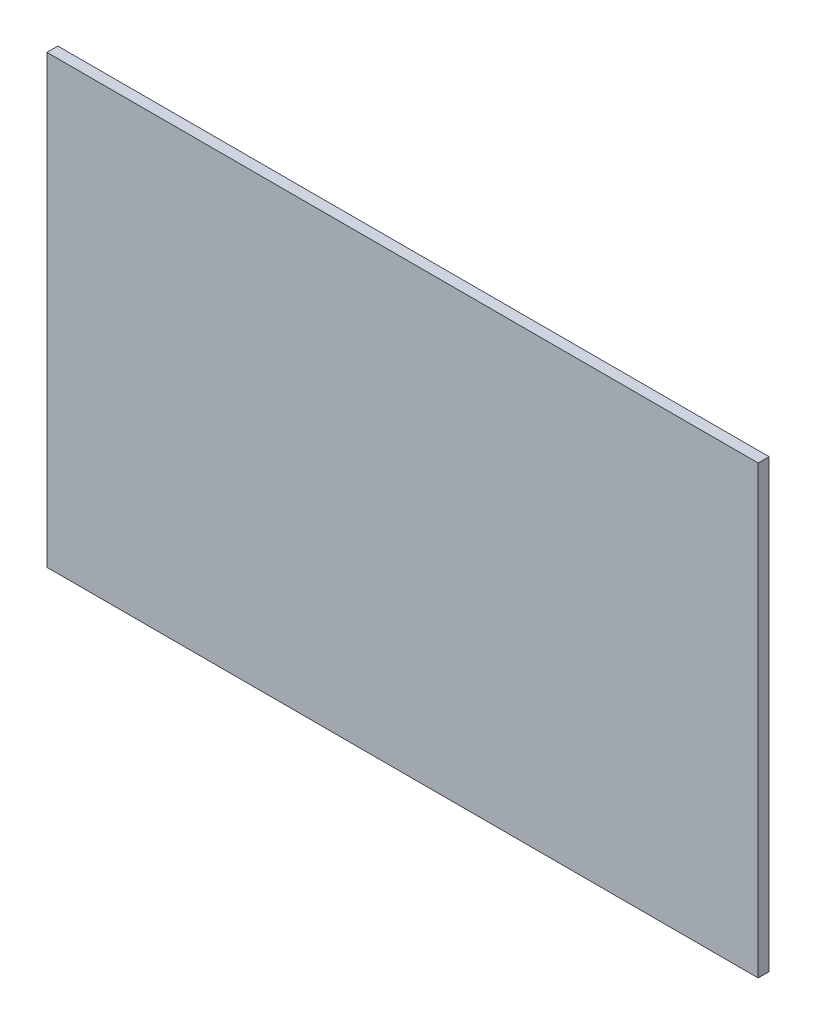
ISO-10303-21;
HEADER;
FILE_DESCRIPTION(('STEP AP214'),'2;1');
FILE_NAME('part.step','',(''),(''),'','','');
FILE_SCHEMA(('AUTOMOTIVE_DESIGN { 1 0 10303 214 1 1 1 1 }'));
ENDSEC;
DATA;
#1=APPLICATION_CONTEXT('core data for automotive mechanical design processes');
#2=APPLICATION_PROTOCOL_DEFINITION('international standard','automotive_design',2000,#1);
#3=PRODUCT_CONTEXT('',#1,'mechanical');
#4=PRODUCT('Part','Part','',(#3));
#5=PRODUCT_RELATED_PRODUCT_CATEGORY('part','',(#4));
#6=PRODUCT_DEFINITION_FORMATION('','',#4);
#7=PRODUCT_DEFINITION_CONTEXT('part definition',#1,'design');
#8=PRODUCT_DEFINITION('design','',#6,#7);
#9=PRODUCT_DEFINITION_SHAPE('','',#8);
#10=(LENGTH_UNIT() NAMED_UNIT(*) SI_UNIT(.MILLI.,.METRE.));
#11=(NAMED_UNIT(*) PLANE_ANGLE_UNIT() SI_UNIT($,.RADIAN.));
#12=(NAMED_UNIT(*) SI_UNIT($,.STERADIAN.) SOLID_ANGLE_UNIT());
#13=UNCERTAINTY_MEASURE_WITH_UNIT(LENGTH_MEASURE(1.E-05),#10,'distance_accuracy_value','');
#14=(GEOMETRIC_REPRESENTATION_CONTEXT(3) GLOBAL_UNCERTAINTY_ASSIGNED_CONTEXT((#13)) GLOBAL_UNIT_ASSIGNED_CONTEXT((#10,
#11,#12)) REPRESENTATION_CONTEXT('',''));
#15=CARTESIAN_POINT('',(0.,0.,0.));
#16=DIRECTION('',(0.,0.,1.));
#17=DIRECTION('',(1.,0.,0.));
#18=AXIS2_PLACEMENT_3D('',#15,#16,#17);
#19=CARTESIAN_POINT('',(-73.1561157407407,37.7825,2.));
#20=DIRECTION('',(1.,0.,0.));
#21=DIRECTION('',(0.,0.,-1.));
#22=AXIS2_PLACEMENT_3D('',#19,#20,#21);
#23=PLANE('',#22);
#24=DIRECTION('',(0.,-1.,0.));
#25=VECTOR('',#24,1.);
#26=CARTESIAN_POINT('',(-73.1561157407407,37.7825,0.));
#27=LINE('',#26,#25);
#28=CARTESIAN_POINT('',(-73.1561157407407,37.7825,0.));
#29=VERTEX_POINT('',#28);
#30=CARTESIAN_POINT('',(-73.1561157407407,-43.71975,0.));
#31=VERTEX_POINT('',#30);
#32=EDGE_CURVE('E96',#29,#31,#27,.T.);
#33=ORIENTED_EDGE('',*,*,#32,.T.);
#34=DIRECTION('',(0.,0.,-1.));
#35=VECTOR('',#34,1.);
#36=CARTESIAN_POINT('',(-73.1561157407407,-43.71975,2.));
#37=LINE('',#36,#35);
#38=CARTESIAN_POINT('',(-73.1561157407407,-43.71975,2.));
#39=VERTEX_POINT('',#38);
#40=EDGE_CURVE('E11',#39,#31,#37,.T.);
#41=ORIENTED_EDGE('',*,*,#40,.F.);
#42=DIRECTION('',(0.,-1.,0.));
#43=VECTOR('',#42,1.);
#44=CARTESIAN_POINT('',(-73.1561157407407,37.7825,2.));
#45=LINE('',#44,#43);
#46=CARTESIAN_POINT('',(-73.1561157407407,37.7825,2.));
#47=VERTEX_POINT('',#46);
#48=EDGE_CURVE('E84',#47,#39,#45,.T.);
#49=ORIENTED_EDGE('',*,*,#48,.F.);
#50=DIRECTION('',(0.,0.,-1.));
#51=VECTOR('',#50,1.);
#52=CARTESIAN_POINT('',(-73.1561157407407,37.7825,2.));
#53=LINE('',#52,#51);
#54=EDGE_CURVE('E92',#47,#29,#53,.T.);
#55=ORIENTED_EDGE('',*,*,#54,.T.);
#56=EDGE_LOOP('',(#33,#41,#49,#55));
#57=FACE_BOUND('',#56,.T.);
#58=ADVANCED_FACE('F33',(#57),#23,.F.);
#59=CARTESIAN_POINT('',(-73.1561157407407,-43.71975,2.));
#60=DIRECTION('',(0.,1.,0.));
#61=DIRECTION('',(0.,0.,1.));
#62=AXIS2_PLACEMENT_3D('',#59,#60,#61);
#63=PLANE('',#62);
#64=DIRECTION('',(1.,0.,0.));
#65=VECTOR('',#64,1.);
#66=CARTESIAN_POINT('',(-73.1561157407407,-43.71975,0.));
#67=LINE('',#66,#65);
#68=CARTESIAN_POINT('',(56.8438842592593,-43.71975,0.));
#69=VERTEX_POINT('',#68);
#70=EDGE_CURVE('E88',#31,#69,#67,.T.);
#71=ORIENTED_EDGE('',*,*,#70,.T.);
#72=DIRECTION('',(0.,0.,-1.));
#73=VECTOR('',#72,1.);
#74=CARTESIAN_POINT('',(56.8438842592593,-43.71975,2.));
#75=LINE('',#74,#73);
#76=CARTESIAN_POINT('',(56.8438842592593,-43.71975,2.));
#77=VERTEX_POINT('',#76);
#78=EDGE_CURVE('E41',#77,#69,#75,.T.);
#79=ORIENTED_EDGE('',*,*,#78,.F.);
#80=DIRECTION('',(1.,0.,0.));
#81=VECTOR('',#80,1.);
#82=CARTESIAN_POINT('',(-73.1561157407407,-43.71975,2.));
#83=LINE('',#82,#81);
#84=EDGE_CURVE('E79',#39,#77,#83,.T.);
#85=ORIENTED_EDGE('',*,*,#84,.F.);
#86=ORIENTED_EDGE('',*,*,#40,.T.);
#87=EDGE_LOOP('',(#71,#79,#85,#86));
#88=FACE_BOUND('',#87,.T.);
#89=ADVANCED_FACE('F87',(#88),#63,.F.);
#90=CARTESIAN_POINT('',(56.8438842592593,37.7825,2.));
#91=DIRECTION('',(-1.,0.,0.));
#92=DIRECTION('',(0.,0.,1.));
#93=AXIS2_PLACEMENT_3D('',#90,#91,#92);
#94=PLANE('',#93);
#95=DIRECTION('',(0.,1.,0.));
#96=VECTOR('',#95,1.);
#97=CARTESIAN_POINT('',(56.8438842592593,37.7825,0.));
#98=LINE('',#97,#96);
#99=CARTESIAN_POINT('',(56.8438842592593,37.7825,0.));
#100=VERTEX_POINT('',#99);
#101=EDGE_CURVE('E66',#69,#100,#98,.T.);
#102=ORIENTED_EDGE('',*,*,#101,.T.);
#103=DIRECTION('',(0.,0.,-1.));
#104=VECTOR('',#103,1.);
#105=CARTESIAN_POINT('',(56.8438842592593,37.7825,2.));
#106=LINE('',#105,#104);
#107=CARTESIAN_POINT('',(56.8438842592593,37.7825,2.));
#108=VERTEX_POINT('',#107);
#109=EDGE_CURVE('E89',#108,#100,#106,.T.);
#110=ORIENTED_EDGE('',*,*,#109,.F.);
#111=DIRECTION('',(0.,1.,0.));
#112=VECTOR('',#111,1.);
#113=CARTESIAN_POINT('',(56.8438842592593,37.7825,2.));
#114=LINE('',#113,#112);
#115=EDGE_CURVE('E82',#77,#108,#114,.T.);
#116=ORIENTED_EDGE('',*,*,#115,.F.);
#117=ORIENTED_EDGE('',*,*,#78,.T.);
#118=EDGE_LOOP('',(#102,#110,#116,#117));
#119=FACE_BOUND('',#118,.T.);
#120=ADVANCED_FACE('F90',(#119),#94,.F.);
#121=CARTESIAN_POINT('',(-73.1561157407407,37.7825,2.));
#122=DIRECTION('',(0.,-1.,0.));
#123=DIRECTION('',(0.,0.,-1.));
#124=AXIS2_PLACEMENT_3D('',#121,#122,#123);
#125=PLANE('',#124);
#126=DIRECTION('',(-1.,0.,0.));
#127=VECTOR('',#126,1.);
#128=CARTESIAN_POINT('',(-73.1561157407407,37.7825,0.));
#129=LINE('',#128,#127);
#130=EDGE_CURVE('E72',#100,#29,#129,.T.);
#131=ORIENTED_EDGE('',*,*,#130,.T.);
#132=ORIENTED_EDGE('',*,*,#54,.F.);
#133=DIRECTION('',(-1.,0.,0.));
#134=VECTOR('',#133,1.);
#135=CARTESIAN_POINT('',(-73.1561157407407,37.7825,2.));
#136=LINE('',#135,#134);
#137=EDGE_CURVE('E49',#108,#47,#136,.T.);
#138=ORIENTED_EDGE('',*,*,#137,.F.);
#139=ORIENTED_EDGE('',*,*,#109,.T.);
#140=EDGE_LOOP('',(#131,#132,#138,#139));
#141=FACE_BOUND('',#140,.T.);
#142=ADVANCED_FACE('F103',(#141),#125,.F.);
#143=CARTESIAN_POINT('',(0.,0.,2.));
#144=DIRECTION('',(0.,0.,1.));
#145=DIRECTION('',(1.,0.,0.));
#146=AXIS2_PLACEMENT_3D('',#143,#144,#145);
#147=PLANE('',#146);
#148=ORIENTED_EDGE('',*,*,#48,.T.);
#149=ORIENTED_EDGE('',*,*,#84,.T.);
#150=ORIENTED_EDGE('',*,*,#115,.T.);
#151=ORIENTED_EDGE('',*,*,#137,.T.);
#152=EDGE_LOOP('',(#148,#149,#150,#151));
#153=FACE_BOUND('',#152,.T.);
#154=ADVANCED_FACE('F80',(#153),#147,.T.);
#155=CARTESIAN_POINT('',(0.,0.,0.));
#156=DIRECTION('',(0.,0.,1.));
#157=DIRECTION('',(1.,0.,0.));
#158=AXIS2_PLACEMENT_3D('',#155,#156,#157);
#159=PLANE('',#158);
#160=ORIENTED_EDGE('',*,*,#32,.F.);
#161=ORIENTED_EDGE('',*,*,#130,.F.);
#162=ORIENTED_EDGE('',*,*,#101,.F.);
#163=ORIENTED_EDGE('',*,*,#70,.F.);
#164=EDGE_LOOP('',(#160,#161,#162,#163));
#165=FACE_BOUND('',#164,.T.);
#166=ADVANCED_FACE('F106',(#165),#159,.F.);
#167=CLOSED_SHELL('',(#58,#89,#120,#142,#154,#166));
#168=MANIFOLD_SOLID_BREP('B2',#167);
#169=ADVANCED_BREP_SHAPE_REPRESENTATION('',(#18,#168),#14);
#170=SHAPE_DEFINITION_REPRESENTATION(#9,#169);
ENDSEC;
END-ISO-10303-21;
